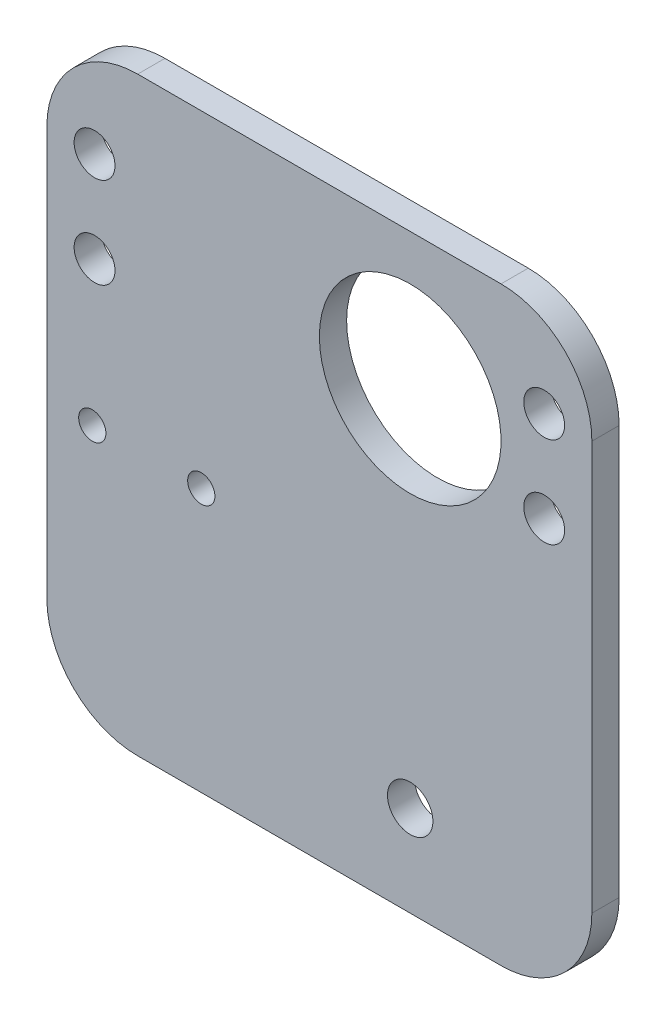
ISO-10303-21;
HEADER;
FILE_DESCRIPTION(('STEP AP214'),'2;1');
FILE_NAME('part.step','',(''),(''),'','','');
FILE_SCHEMA(('AUTOMOTIVE_DESIGN { 1 0 10303 214 1 1 1 1 }'));
ENDSEC;
DATA;
#1=APPLICATION_CONTEXT('core data for automotive mechanical design processes');
#2=APPLICATION_PROTOCOL_DEFINITION('international standard','automotive_design',2000,#1);
#3=PRODUCT_CONTEXT('',#1,'mechanical');
#4=PRODUCT('Part','Part','',(#3));
#5=PRODUCT_RELATED_PRODUCT_CATEGORY('part','',(#4));
#6=PRODUCT_DEFINITION_FORMATION('','',#4);
#7=PRODUCT_DEFINITION_CONTEXT('part definition',#1,'design');
#8=PRODUCT_DEFINITION('design','',#6,#7);
#9=PRODUCT_DEFINITION_SHAPE('','',#8);
#10=(LENGTH_UNIT() NAMED_UNIT(*) SI_UNIT(.MILLI.,.METRE.));
#11=(NAMED_UNIT(*) PLANE_ANGLE_UNIT() SI_UNIT($,.RADIAN.));
#12=(NAMED_UNIT(*) SI_UNIT($,.STERADIAN.) SOLID_ANGLE_UNIT());
#13=UNCERTAINTY_MEASURE_WITH_UNIT(LENGTH_MEASURE(1.E-05),#10,'distance_accuracy_value','');
#14=(GEOMETRIC_REPRESENTATION_CONTEXT(3) GLOBAL_UNCERTAINTY_ASSIGNED_CONTEXT((#13)) GLOBAL_UNIT_ASSIGNED_CONTEXT((#10,
#11,#12)) REPRESENTATION_CONTEXT('',''));
#15=CARTESIAN_POINT('',(0.,0.,0.));
#16=DIRECTION('',(0.,0.,1.));
#17=DIRECTION('',(1.,0.,0.));
#18=AXIS2_PLACEMENT_3D('',#15,#16,#17);
#19=CARTESIAN_POINT('',(0.,0.,0.001));
#20=DIRECTION('',(0.,0.,1.));
#21=DIRECTION('',(1.,0.,0.));
#22=AXIS2_PLACEMENT_3D('',#19,#20,#21);
#23=PLANE('',#22);
#24=CARTESIAN_POINT('',(45.5164785410153,-28.4674981786718,0.001));
#25=DIRECTION('',(0.,0.,-1.));
#26=DIRECTION('',(-1.,0.,0.));
#27=AXIS2_PLACEMENT_3D('',#24,#25,#26);
#28=CIRCLE('',#27,2.5);
#29=CARTESIAN_POINT('',(43.0164785410153,-28.4674981786718,0.001));
#30=VERTEX_POINT('',#29);
#31=EDGE_CURVE('E268',#30,#30,#28,.T.);
#32=ORIENTED_EDGE('',*,*,#31,.F.);
#33=EDGE_LOOP('',(#32));
#34=FACE_BOUND('',#33,.T.);
#35=CARTESIAN_POINT('',(45.5164785410153,-28.4674981786718,0.000999999999999916));
#36=DIRECTION('',(0.,0.,1.));
#37=DIRECTION('',(1.,0.,0.));
#38=AXIS2_PLACEMENT_3D('',#35,#36,#37);
#39=CIRCLE('',#38,7.5);
#40=CARTESIAN_POINT('',(53.0164785410153,-28.4674981786718,0.000999999999999916));
#41=VERTEX_POINT('',#40);
#42=EDGE_CURVE('E131',#41,#41,#39,.T.);
#43=ORIENTED_EDGE('',*,*,#42,.F.);
#44=EDGE_LOOP('',(#43));
#45=FACE_BOUND('',#44,.T.);
#46=ADVANCED_FACE('F39',(#34,#45),#23,.F.);
#47=CARTESIAN_POINT('',(45.5164785410153,-28.4674981786718,0.000999999999999916));
#48=DIRECTION('',(0.,0.,1.));
#49=DIRECTION('',(1.,0.,0.));
#50=AXIS2_PLACEMENT_3D('',#47,#48,#49);
#51=CIRCLE('',#50,9.5);
#52=CARTESIAN_POINT('',(55.0164785410153,-28.4674981786718,0.000999999999999916));
#53=VERTEX_POINT('',#52);
#54=EDGE_CURVE('E381',#53,#53,#51,.T.);
#55=ORIENTED_EDGE('',*,*,#54,.T.);
#56=EDGE_LOOP('',(#55));
#57=FACE_BOUND('',#56,.T.);
#58=CARTESIAN_POINT('',(10.5164785410153,-9.46749817867184,0.00100000000000013));
#59=DIRECTION('',(0.,0.,1.));
#60=DIRECTION('',(1.,0.,0.));
#61=AXIS2_PLACEMENT_3D('',#58,#59,#60);
#62=CIRCLE('',#61,1.5);
#63=CARTESIAN_POINT('',(12.0164785410153,-9.46749817867184,0.00100000000000013));
#64=VERTEX_POINT('',#63);
#65=EDGE_CURVE('E274',#64,#64,#62,.T.);
#66=ORIENTED_EDGE('',*,*,#65,.T.);
#67=EDGE_LOOP('',(#66));
#68=FACE_BOUND('',#67,.T.);
#69=CARTESIAN_POINT('',(22.5164785410153,-9.46749817867184,0.00100000000000013));
#70=DIRECTION('',(0.,0.,1.));
#71=DIRECTION('',(1.,0.,0.));
#72=AXIS2_PLACEMENT_3D('',#69,#70,#71);
#73=CIRCLE('',#72,1.5);
#74=CARTESIAN_POINT('',(24.0164785410153,-9.46749817867184,0.00100000000000013));
#75=VERTEX_POINT('',#74);
#76=EDGE_CURVE('E389',#75,#75,#73,.T.);
#77=ORIENTED_EDGE('',*,*,#76,.T.);
#78=EDGE_LOOP('',(#77));
#79=FACE_BOUND('',#78,.T.);
#80=CARTESIAN_POINT('',(45.5164785410153,11.5325018213282,0.001));
#81=DIRECTION('',(0.,0.,-1.));
#82=DIRECTION('',(-1.,0.,0.));
#83=AXIS2_PLACEMENT_3D('',#80,#81,#82);
#84=CIRCLE('',#83,10.);
#85=CARTESIAN_POINT('',(35.5164785410153,11.5325018213282,0.001));
#86=VERTEX_POINT('',#85);
#87=EDGE_CURVE('E267',#86,#86,#84,.T.);
#88=ORIENTED_EDGE('',*,*,#87,.F.);
#89=EDGE_LOOP('',(#88));
#90=FACE_BOUND('',#89,.T.);
#91=CARTESIAN_POINT('',(60.2664785410153,6.53250182132816,0.001));
#92=DIRECTION('',(0.,0.,1.));
#93=DIRECTION('',(1.,0.,0.));
#94=AXIS2_PLACEMENT_3D('',#91,#92,#93);
#95=CIRCLE('',#94,3.00000000000002);
#96=CARTESIAN_POINT('',(63.2664785410153,6.53250182132816,0.001));
#97=VERTEX_POINT('',#96);
#98=EDGE_CURVE('E191',#97,#97,#95,.F.);
#99=ORIENTED_EDGE('',*,*,#98,.F.);
#100=EDGE_LOOP('',(#99));
#101=FACE_BOUND('',#100,.T.);
#102=DIRECTION('',(1.,0.,0.));
#103=VECTOR('',#102,1.);
#104=CARTESIAN_POINT('',(5.51647854101529,26.5325018213282,0.001));
#105=LINE('',#104,#103);
#106=CARTESIAN_POINT('',(15.5164785410153,26.5325018213282,0.001));
#107=VERTEX_POINT('',#106);
#108=CARTESIAN_POINT('',(55.5164785410153,26.5325018213282,0.001));
#109=VERTEX_POINT('',#108);
#110=EDGE_CURVE('E109',#107,#109,#105,.T.);
#111=ORIENTED_EDGE('',*,*,#110,.T.);
#112=CARTESIAN_POINT('',(55.5164785410153,16.5325018213282,0.00100000000000013));
#113=DIRECTION('',(0.,0.,1.));
#114=DIRECTION('',(1.,0.,0.));
#115=AXIS2_PLACEMENT_3D('',#112,#113,#114);
#116=CIRCLE('',#115,10.);
#117=CARTESIAN_POINT('',(65.5164785410153,16.5325018213282,0.001));
#118=VERTEX_POINT('',#117);
#119=EDGE_CURVE('E143',#109,#118,#116,.F.);
#120=ORIENTED_EDGE('',*,*,#119,.T.);
#121=DIRECTION('',(0.,-1.,0.));
#122=VECTOR('',#121,1.);
#123=CARTESIAN_POINT('',(65.5164785410153,26.5325018213282,0.001));
#124=LINE('',#123,#122);
#125=CARTESIAN_POINT('',(65.5164785410153,-28.4674981786718,0.001));
#126=VERTEX_POINT('',#125);
#127=EDGE_CURVE('E127',#118,#126,#124,.T.);
#128=ORIENTED_EDGE('',*,*,#127,.T.);
#129=CARTESIAN_POINT('',(55.5164785410153,-28.4674981786718,0.00100000000000013));
#130=DIRECTION('',(0.,0.,1.));
#131=DIRECTION('',(1.,0.,0.));
#132=AXIS2_PLACEMENT_3D('',#129,#130,#131);
#133=CIRCLE('',#132,10.);
#134=CARTESIAN_POINT('',(55.5164785410153,-38.4674981786718,0.001));
#135=VERTEX_POINT('',#134);
#136=EDGE_CURVE('E141',#126,#135,#133,.F.);
#137=ORIENTED_EDGE('',*,*,#136,.T.);
#138=DIRECTION('',(1.,0.,0.));
#139=VECTOR('',#138,1.);
#140=CARTESIAN_POINT('',(5.51647854101529,-38.4674981786718,0.001));
#141=LINE('',#140,#139);
#142=CARTESIAN_POINT('',(15.5164785410153,-38.4674981786718,0.001));
#143=VERTEX_POINT('',#142);
#144=EDGE_CURVE('E177',#143,#135,#141,.T.);
#145=ORIENTED_EDGE('',*,*,#144,.F.);
#146=CARTESIAN_POINT('',(15.5164785410153,-28.4674981786718,0.00100000000000013));
#147=DIRECTION('',(0.,0.,1.));
#148=DIRECTION('',(1.,0.,0.));
#149=AXIS2_PLACEMENT_3D('',#146,#147,#148);
#150=CIRCLE('',#149,10.);
#151=CARTESIAN_POINT('',(5.51647854101529,-28.4674981786718,0.001));
#152=VERTEX_POINT('',#151);
#153=EDGE_CURVE('E116',#143,#152,#150,.F.);
#154=ORIENTED_EDGE('',*,*,#153,.T.);
#155=DIRECTION('',(0.,-1.,0.));
#156=VECTOR('',#155,1.);
#157=CARTESIAN_POINT('',(5.51647854101529,1.53250182132815,0.001));
#158=LINE('',#157,#156);
#159=CARTESIAN_POINT('',(5.51647854101529,16.5325018213282,0.001));
#160=VERTEX_POINT('',#159);
#161=EDGE_CURVE('E111',#160,#152,#158,.T.);
#162=ORIENTED_EDGE('',*,*,#161,.F.);
#163=CARTESIAN_POINT('',(15.5164785410153,16.5325018213282,0.00100000000000013));
#164=DIRECTION('',(0.,0.,1.));
#165=DIRECTION('',(1.,0.,0.));
#166=AXIS2_PLACEMENT_3D('',#163,#164,#165);
#167=CIRCLE('',#166,10.);
#168=EDGE_CURVE('E105',#160,#107,#167,.F.);
#169=ORIENTED_EDGE('',*,*,#168,.T.);
#170=EDGE_LOOP('',(#111,#120,#128,#137,#145,#154,#162,#169));
#171=FACE_BOUND('',#170,.T.);
#172=CARTESIAN_POINT('',(10.7664785410153,6.53250182132816,0.001));
#173=DIRECTION('',(0.,0.,1.));
#174=DIRECTION('',(1.,0.,0.));
#175=AXIS2_PLACEMENT_3D('',#172,#173,#174);
#176=CIRCLE('',#175,3.);
#177=CARTESIAN_POINT('',(13.7664785410153,6.53250182132816,0.001));
#178=VERTEX_POINT('',#177);
#179=EDGE_CURVE('E184',#178,#178,#176,.T.);
#180=ORIENTED_EDGE('',*,*,#179,.T.);
#181=EDGE_LOOP('',(#180));
#182=FACE_BOUND('',#181,.T.);
#183=CARTESIAN_POINT('',(60.2664785410153,16.5325018213282,0.001));
#184=DIRECTION('',(0.,0.,1.));
#185=DIRECTION('',(1.,0.,0.));
#186=AXIS2_PLACEMENT_3D('',#183,#184,#185);
#187=CIRCLE('',#186,3.00000000000002);
#188=CARTESIAN_POINT('',(63.2664785410153,16.5325018213282,0.001));
#189=VERTEX_POINT('',#188);
#190=EDGE_CURVE('E187',#189,#189,#187,.F.);
#191=ORIENTED_EDGE('',*,*,#190,.F.);
#192=EDGE_LOOP('',(#191));
#193=FACE_BOUND('',#192,.T.);
#194=CARTESIAN_POINT('',(10.7664785410153,16.5325018213282,0.001));
#195=DIRECTION('',(0.,0.,1.));
#196=DIRECTION('',(1.,0.,0.));
#197=AXIS2_PLACEMENT_3D('',#194,#195,#196);
#198=CIRCLE('',#197,3.);
#199=CARTESIAN_POINT('',(13.7664785410153,16.5325018213282,0.001));
#200=VERTEX_POINT('',#199);
#201=EDGE_CURVE('E135',#200,#200,#198,.F.);
#202=ORIENTED_EDGE('',*,*,#201,.F.);
#203=EDGE_LOOP('',(#202));
#204=FACE_BOUND('',#203,.T.);
#205=ADVANCED_FACE('F107',(#57,#68,#79,#90,#101,#171,#182,#193,#204),#23,.F.);
#206=CARTESIAN_POINT('',(10.7664785410153,6.53250182132816,0.001));
#207=DIRECTION('',(0.,0.,-1.));
#208=DIRECTION('',(-1.,0.,0.));
#209=AXIS2_PLACEMENT_3D('',#206,#207,#208);
#210=CYLINDRICAL_SURFACE('',#209,3.);
#211=ORIENTED_EDGE('',*,*,#179,.F.);
#212=EDGE_LOOP('',(#211));
#213=FACE_BOUND('',#212,.T.);
#214=CARTESIAN_POINT('',(10.7664785410153,6.53250182132816,0.));
#215=DIRECTION('',(0.,0.,1.));
#216=DIRECTION('',(1.,0.,0.));
#217=AXIS2_PLACEMENT_3D('',#214,#215,#216);
#218=CIRCLE('',#217,3.);
#219=CARTESIAN_POINT('',(13.7664785410153,6.53250182132816,0.));
#220=VERTEX_POINT('',#219);
#221=EDGE_CURVE('E183',#220,#220,#218,.T.);
#222=ORIENTED_EDGE('',*,*,#221,.T.);
#223=EDGE_LOOP('',(#222));
#224=FACE_BOUND('',#223,.T.);
#225=ADVANCED_FACE('F202',(#213,#224),#210,.T.);
#226=CARTESIAN_POINT('',(10.7664785410153,6.53250182132816,0.));
#227=DIRECTION('',(0.,0.,1.));
#228=DIRECTION('',(1.,0.,0.));
#229=AXIS2_PLACEMENT_3D('',#226,#227,#228);
#230=PLANE('',#229);
#231=CARTESIAN_POINT('',(10.7664785410153,6.53250182132816,0.));
#232=DIRECTION('',(0.,0.,1.));
#233=DIRECTION('',(1.,0.,0.));
#234=AXIS2_PLACEMENT_3D('',#231,#232,#233);
#235=CIRCLE('',#234,2.25);
#236=CARTESIAN_POINT('',(13.0164785410153,6.53250182132816,0.));
#237=VERTEX_POINT('',#236);
#238=EDGE_CURVE('E175',#237,#237,#235,.T.);
#239=ORIENTED_EDGE('',*,*,#238,.T.);
#240=EDGE_LOOP('',(#239));
#241=FACE_BOUND('',#240,.T.);
#242=ORIENTED_EDGE('',*,*,#221,.F.);
#243=EDGE_LOOP('',(#242));
#244=FACE_BOUND('',#243,.T.);
#245=ADVANCED_FACE('F209',(#241,#244),#230,.F.);
#246=CARTESIAN_POINT('',(10.7664785410153,6.53250182132816,0.));
#247=DIRECTION('',(0.,0.,1.));
#248=DIRECTION('',(1.,0.,0.));
#249=AXIS2_PLACEMENT_3D('',#246,#247,#248);
#250=CYLINDRICAL_SURFACE('',#249,2.25);
#251=ORIENTED_EDGE('',*,*,#238,.F.);
#252=EDGE_LOOP('',(#251));
#253=FACE_BOUND('',#252,.T.);
#254=CARTESIAN_POINT('',(10.7664785410153,6.53250182132816,3.001));
#255=DIRECTION('',(0.,0.,-1.));
#256=DIRECTION('',(-1.,0.,0.));
#257=AXIS2_PLACEMENT_3D('',#254,#255,#256);
#258=CIRCLE('',#257,2.25);
#259=CARTESIAN_POINT('',(8.51647854101528,6.53250182132816,3.001));
#260=VERTEX_POINT('',#259);
#261=EDGE_CURVE('E282',#260,#260,#258,.T.);
#262=ORIENTED_EDGE('',*,*,#261,.F.);
#263=EDGE_LOOP('',(#262));
#264=FACE_BOUND('',#263,.T.);
#265=ADVANCED_FACE('F231',(#253,#264),#250,.F.);
#266=CARTESIAN_POINT('',(0.,0.,3.001));
#267=DIRECTION('',(0.,0.,1.));
#268=DIRECTION('',(1.,0.,0.));
#269=AXIS2_PLACEMENT_3D('',#266,#267,#268);
#270=PLANE('',#269);
#271=CARTESIAN_POINT('',(10.5164785410153,-9.46749817867184,3.001));
#272=DIRECTION('',(0.,0.,1.));
#273=DIRECTION('',(1.,0.,0.));
#274=AXIS2_PLACEMENT_3D('',#271,#272,#273);
#275=CIRCLE('',#274,1.5);
#276=CARTESIAN_POINT('',(12.0164785410153,-9.46749817867184,3.001));
#277=VERTEX_POINT('',#276);
#278=EDGE_CURVE('E386',#277,#277,#275,.T.);
#279=ORIENTED_EDGE('',*,*,#278,.F.);
#280=EDGE_LOOP('',(#279));
#281=FACE_BOUND('',#280,.T.);
#282=CARTESIAN_POINT('',(22.5164785410153,-9.46749817867184,3.001));
#283=DIRECTION('',(0.,0.,1.));
#284=DIRECTION('',(1.,0.,0.));
#285=AXIS2_PLACEMENT_3D('',#282,#283,#284);
#286=CIRCLE('',#285,1.5);
#287=CARTESIAN_POINT('',(24.0164785410153,-9.46749817867184,3.001));
#288=VERTEX_POINT('',#287);
#289=EDGE_CURVE('E385',#288,#288,#286,.T.);
#290=ORIENTED_EDGE('',*,*,#289,.F.);
#291=EDGE_LOOP('',(#290));
#292=FACE_BOUND('',#291,.T.);
#293=CARTESIAN_POINT('',(60.2664785410153,16.5325018213282,3.001));
#294=DIRECTION('',(0.,0.,-1.));
#295=DIRECTION('',(-1.,0.,0.));
#296=AXIS2_PLACEMENT_3D('',#293,#294,#295);
#297=CIRCLE('',#296,2.25);
#298=CARTESIAN_POINT('',(58.0164785410153,16.5325018213282,3.001));
#299=VERTEX_POINT('',#298);
#300=EDGE_CURVE('E285',#299,#299,#297,.T.);
#301=ORIENTED_EDGE('',*,*,#300,.T.);
#302=EDGE_LOOP('',(#301));
#303=FACE_BOUND('',#302,.T.);
#304=ORIENTED_EDGE('',*,*,#261,.T.);
#305=EDGE_LOOP('',(#304));
#306=FACE_BOUND('',#305,.T.);
#307=CARTESIAN_POINT('',(10.7664785410153,16.5325018213282,3.001));
#308=DIRECTION('',(0.,0.,-1.));
#309=DIRECTION('',(-1.,0.,0.));
#310=AXIS2_PLACEMENT_3D('',#307,#308,#309);
#311=CIRCLE('',#310,2.25);
#312=CARTESIAN_POINT('',(8.51647854101528,16.5325018213282,3.001));
#313=VERTEX_POINT('',#312);
#314=EDGE_CURVE('E279',#313,#313,#311,.T.);
#315=ORIENTED_EDGE('',*,*,#314,.T.);
#316=EDGE_LOOP('',(#315));
#317=FACE_BOUND('',#316,.T.);
#318=CARTESIAN_POINT('',(45.5164785410153,11.5325018213282,3.001));
#319=DIRECTION('',(0.,0.,-1.));
#320=DIRECTION('',(-1.,0.,0.));
#321=AXIS2_PLACEMENT_3D('',#318,#319,#320);
#322=CIRCLE('',#321,10.);
#323=CARTESIAN_POINT('',(35.5164785410153,11.5325018213282,3.001));
#324=VERTEX_POINT('',#323);
#325=EDGE_CURVE('E271',#324,#324,#322,.T.);
#326=ORIENTED_EDGE('',*,*,#325,.T.);
#327=EDGE_LOOP('',(#326));
#328=FACE_BOUND('',#327,.T.);
#329=CARTESIAN_POINT('',(60.2664785410153,6.53250182132816,3.001));
#330=DIRECTION('',(0.,0.,-1.));
#331=DIRECTION('',(-1.,0.,0.));
#332=AXIS2_PLACEMENT_3D('',#329,#330,#331);
#333=CIRCLE('',#332,2.25);
#334=CARTESIAN_POINT('',(58.0164785410153,6.53250182132816,3.001));
#335=VERTEX_POINT('',#334);
#336=EDGE_CURVE('E288',#335,#335,#333,.T.);
#337=ORIENTED_EDGE('',*,*,#336,.T.);
#338=EDGE_LOOP('',(#337));
#339=FACE_BOUND('',#338,.T.);
#340=DIRECTION('',(0.,-1.,0.));
#341=VECTOR('',#340,1.);
#342=CARTESIAN_POINT('',(65.5164785410153,26.5325018213282,3.001));
#343=LINE('',#342,#341);
#344=CARTESIAN_POINT('',(65.5164785410153,16.5325018213282,3.001));
#345=VERTEX_POINT('',#344);
#346=CARTESIAN_POINT('',(65.5164785410153,-28.4674981786718,3.001));
#347=VERTEX_POINT('',#346);
#348=EDGE_CURVE('E165',#345,#347,#343,.T.);
#349=ORIENTED_EDGE('',*,*,#348,.F.);
#350=CARTESIAN_POINT('',(55.5164785410153,16.5325018213282,3.001));
#351=DIRECTION('',(0.,0.,1.));
#352=DIRECTION('',(1.,0.,0.));
#353=AXIS2_PLACEMENT_3D('',#350,#351,#352);
#354=CIRCLE('',#353,10.);
#355=CARTESIAN_POINT('',(55.5164785410153,26.5325018213282,3.001));
#356=VERTEX_POINT('',#355);
#357=EDGE_CURVE('E154',#345,#356,#354,.T.);
#358=ORIENTED_EDGE('',*,*,#357,.T.);
#359=DIRECTION('',(1.,0.,0.));
#360=VECTOR('',#359,1.);
#361=CARTESIAN_POINT('',(5.51647854101529,26.5325018213282,3.001));
#362=LINE('',#361,#360);
#363=CARTESIAN_POINT('',(15.5164785410153,26.5325018213282,3.001));
#364=VERTEX_POINT('',#363);
#365=EDGE_CURVE('E173',#364,#356,#362,.T.);
#366=ORIENTED_EDGE('',*,*,#365,.F.);
#367=CARTESIAN_POINT('',(15.5164785410153,16.5325018213282,3.001));
#368=DIRECTION('',(0.,0.,1.));
#369=DIRECTION('',(1.,0.,0.));
#370=AXIS2_PLACEMENT_3D('',#367,#368,#369);
#371=CIRCLE('',#370,10.);
#372=CARTESIAN_POINT('',(5.51647854101529,16.5325018213282,3.001));
#373=VERTEX_POINT('',#372);
#374=EDGE_CURVE('E130',#364,#373,#371,.T.);
#375=ORIENTED_EDGE('',*,*,#374,.T.);
#376=DIRECTION('',(0.,-1.,0.));
#377=VECTOR('',#376,1.);
#378=CARTESIAN_POINT('',(5.51647854101529,26.5325018213282,3.001));
#379=LINE('',#378,#377);
#380=CARTESIAN_POINT('',(5.51647854101529,-28.4674981786718,3.001));
#381=VERTEX_POINT('',#380);
#382=EDGE_CURVE('E126',#373,#381,#379,.T.);
#383=ORIENTED_EDGE('',*,*,#382,.T.);
#384=CARTESIAN_POINT('',(15.5164785410153,-28.4674981786718,3.001));
#385=DIRECTION('',(0.,0.,1.));
#386=DIRECTION('',(1.,0.,0.));
#387=AXIS2_PLACEMENT_3D('',#384,#385,#386);
#388=CIRCLE('',#387,10.);
#389=CARTESIAN_POINT('',(15.5164785410153,-38.4674981786718,3.001));
#390=VERTEX_POINT('',#389);
#391=EDGE_CURVE('E61',#381,#390,#388,.T.);
#392=ORIENTED_EDGE('',*,*,#391,.T.);
#393=DIRECTION('',(1.,0.,0.));
#394=VECTOR('',#393,1.);
#395=CARTESIAN_POINT('',(5.51647854101529,-38.4674981786718,3.001));
#396=LINE('',#395,#394);
#397=CARTESIAN_POINT('',(55.5164785410153,-38.4674981786718,3.001));
#398=VERTEX_POINT('',#397);
#399=EDGE_CURVE('E163',#390,#398,#396,.T.);
#400=ORIENTED_EDGE('',*,*,#399,.T.);
#401=CARTESIAN_POINT('',(55.5164785410153,-28.4674981786718,3.001));
#402=DIRECTION('',(0.,0.,1.));
#403=DIRECTION('',(1.,0.,0.));
#404=AXIS2_PLACEMENT_3D('',#401,#402,#403);
#405=CIRCLE('',#404,10.);
#406=EDGE_CURVE('E152',#398,#347,#405,.T.);
#407=ORIENTED_EDGE('',*,*,#406,.T.);
#408=EDGE_LOOP('',(#349,#358,#366,#375,#383,#392,#400,#407));
#409=FACE_BOUND('',#408,.T.);
#410=CARTESIAN_POINT('',(45.5164785410153,-28.4674981786718,3.001));
#411=DIRECTION('',(0.,0.,-1.));
#412=DIRECTION('',(-1.,0.,0.));
#413=AXIS2_PLACEMENT_3D('',#410,#411,#412);
#414=CIRCLE('',#413,2.5);
#415=CARTESIAN_POINT('',(43.0164785410153,-28.4674981786718,3.001));
#416=VERTEX_POINT('',#415);
#417=EDGE_CURVE('E265',#416,#416,#414,.T.);
#418=ORIENTED_EDGE('',*,*,#417,.T.);
#419=EDGE_LOOP('',(#418));
#420=FACE_BOUND('',#419,.T.);
#421=ADVANCED_FACE('F217',(#281,#292,#303,#306,#317,#328,#339,#409,#420),#270,.T.);
#422=CARTESIAN_POINT('',(5.51647854101529,26.5325018213282,3.001));
#423=DIRECTION('',(0.,1.,0.));
#424=DIRECTION('',(0.,0.,1.));
#425=AXIS2_PLACEMENT_3D('',#422,#423,#424);
#426=PLANE('',#425);
#427=ORIENTED_EDGE('',*,*,#365,.T.);
#428=DIRECTION('',(0.,0.,-1.));
#429=VECTOR('',#428,1.);
#430=CARTESIAN_POINT('',(55.5164785410153,26.5325018213282,3.001));
#431=LINE('',#430,#429);
#432=EDGE_CURVE('E117',#356,#109,#431,.T.);
#433=ORIENTED_EDGE('',*,*,#432,.T.);
#434=ORIENTED_EDGE('',*,*,#110,.F.);
#435=DIRECTION('',(0.,0.,-1.));
#436=VECTOR('',#435,1.);
#437=CARTESIAN_POINT('',(15.5164785410153,26.5325018213282,3.001));
#438=LINE('',#437,#436);
#439=EDGE_CURVE('E123',#107,#364,#438,.F.);
#440=ORIENTED_EDGE('',*,*,#439,.T.);
#441=EDGE_LOOP('',(#427,#433,#434,#440));
#442=FACE_BOUND('',#441,.T.);
#443=ADVANCED_FACE('F122',(#442),#426,.T.);
#444=CARTESIAN_POINT('',(65.5164785410153,26.5325018213282,3.001));
#445=DIRECTION('',(1.,0.,0.));
#446=DIRECTION('',(0.,0.,-1.));
#447=AXIS2_PLACEMENT_3D('',#444,#445,#446);
#448=PLANE('',#447);
#449=ORIENTED_EDGE('',*,*,#127,.F.);
#450=DIRECTION('',(0.,0.,-1.));
#451=VECTOR('',#450,1.);
#452=CARTESIAN_POINT('',(65.5164785410153,16.5325018213282,3.001));
#453=LINE('',#452,#451);
#454=EDGE_CURVE('E148',#118,#345,#453,.F.);
#455=ORIENTED_EDGE('',*,*,#454,.T.);
#456=ORIENTED_EDGE('',*,*,#348,.T.);
#457=DIRECTION('',(0.,0.,-1.));
#458=VECTOR('',#457,1.);
#459=CARTESIAN_POINT('',(65.5164785410153,-28.4674981786718,0.00100000000000013));
#460=LINE('',#459,#458);
#461=EDGE_CURVE('E145',#347,#126,#460,.T.);
#462=ORIENTED_EDGE('',*,*,#461,.T.);
#463=EDGE_LOOP('',(#449,#455,#456,#462));
#464=FACE_BOUND('',#463,.T.);
#465=ADVANCED_FACE('F221',(#464),#448,.T.);
#466=CARTESIAN_POINT('',(5.51647854101529,-38.4674981786718,3.001));
#467=DIRECTION('',(0.,1.,0.));
#468=DIRECTION('',(0.,0.,1.));
#469=AXIS2_PLACEMENT_3D('',#466,#467,#468);
#470=PLANE('',#469);
#471=ORIENTED_EDGE('',*,*,#144,.T.);
#472=DIRECTION('',(0.,0.,-1.));
#473=VECTOR('',#472,1.);
#474=CARTESIAN_POINT('',(55.5164785410153,-38.4674981786718,3.001));
#475=LINE('',#474,#473);
#476=EDGE_CURVE('E54',#135,#398,#475,.F.);
#477=ORIENTED_EDGE('',*,*,#476,.T.);
#478=ORIENTED_EDGE('',*,*,#399,.F.);
#479=DIRECTION('',(0.,0.,-1.));
#480=VECTOR('',#479,1.);
#481=CARTESIAN_POINT('',(15.5164785410153,-38.4674981786718,3.001));
#482=LINE('',#481,#480);
#483=EDGE_CURVE('E156',#390,#143,#482,.T.);
#484=ORIENTED_EDGE('',*,*,#483,.T.);
#485=EDGE_LOOP('',(#471,#477,#478,#484));
#486=FACE_BOUND('',#485,.T.);
#487=ADVANCED_FACE('F224',(#486),#470,.F.);
#488=CARTESIAN_POINT('',(5.51647854101529,1.53250182132815,3.001));
#489=DIRECTION('',(1.,0.,0.));
#490=DIRECTION('',(0.,1.,0.));
#491=AXIS2_PLACEMENT_3D('',#488,#489,#490);
#492=PLANE('',#491);
#493=ORIENTED_EDGE('',*,*,#161,.T.);
#494=DIRECTION('',(0.,0.,-1.));
#495=VECTOR('',#494,1.);
#496=CARTESIAN_POINT('',(5.51647854101529,-28.4674981786718,3.001));
#497=LINE('',#496,#495);
#498=EDGE_CURVE('E11',#152,#381,#497,.F.);
#499=ORIENTED_EDGE('',*,*,#498,.T.);
#500=ORIENTED_EDGE('',*,*,#382,.F.);
#501=DIRECTION('',(0.,0.,-1.));
#502=VECTOR('',#501,1.);
#503=CARTESIAN_POINT('',(5.51647854101529,16.5325018213282,0.00100000000000013));
#504=LINE('',#503,#502);
#505=EDGE_CURVE('E47',#373,#160,#504,.T.);
#506=ORIENTED_EDGE('',*,*,#505,.T.);
#507=EDGE_LOOP('',(#493,#499,#500,#506));
#508=FACE_BOUND('',#507,.T.);
#509=ADVANCED_FACE('F161',(#508),#492,.F.);
#510=CARTESIAN_POINT('',(60.2664785410153,16.5325018213282,0.001));
#511=DIRECTION('',(0.,0.,-1.));
#512=DIRECTION('',(-1.,0.,0.));
#513=AXIS2_PLACEMENT_3D('',#510,#511,#512);
#514=CYLINDRICAL_SURFACE('',#513,3.00000000000002);
#515=ORIENTED_EDGE('',*,*,#190,.T.);
#516=EDGE_LOOP('',(#515));
#517=FACE_BOUND('',#516,.T.);
#518=CARTESIAN_POINT('',(60.2664785410153,16.5325018213282,0.));
#519=DIRECTION('',(0.,0.,1.));
#520=DIRECTION('',(1.,0.,0.));
#521=AXIS2_PLACEMENT_3D('',#518,#519,#520);
#522=CIRCLE('',#521,3.00000000000002);
#523=CARTESIAN_POINT('',(63.2664785410153,16.5325018213282,0.));
#524=VERTEX_POINT('',#523);
#525=EDGE_CURVE('E168',#524,#524,#522,.T.);
#526=ORIENTED_EDGE('',*,*,#525,.T.);
#527=EDGE_LOOP('',(#526));
#528=FACE_BOUND('',#527,.T.);
#529=ADVANCED_FACE('F230',(#517,#528),#514,.T.);
#530=CARTESIAN_POINT('',(60.2664785410153,16.5325018213282,0.));
#531=DIRECTION('',(0.,0.,1.));
#532=DIRECTION('',(1.,0.,0.));
#533=AXIS2_PLACEMENT_3D('',#530,#531,#532);
#534=PLANE('',#533);
#535=CARTESIAN_POINT('',(60.2664785410153,16.5325018213282,0.));
#536=DIRECTION('',(0.,0.,1.));
#537=DIRECTION('',(1.,0.,0.));
#538=AXIS2_PLACEMENT_3D('',#535,#536,#537);
#539=CIRCLE('',#538,2.25);
#540=CARTESIAN_POINT('',(62.5164785410153,16.5325018213282,0.));
#541=VERTEX_POINT('',#540);
#542=EDGE_CURVE('E304',#541,#541,#539,.T.);
#543=ORIENTED_EDGE('',*,*,#542,.T.);
#544=EDGE_LOOP('',(#543));
#545=FACE_BOUND('',#544,.T.);
#546=ORIENTED_EDGE('',*,*,#525,.F.);
#547=EDGE_LOOP('',(#546));
#548=FACE_BOUND('',#547,.T.);
#549=ADVANCED_FACE('F312',(#545,#548),#534,.F.);
#550=CARTESIAN_POINT('',(60.2664785410153,16.5325018213282,0.));
#551=DIRECTION('',(0.,0.,1.));
#552=DIRECTION('',(1.,0.,0.));
#553=AXIS2_PLACEMENT_3D('',#550,#551,#552);
#554=CYLINDRICAL_SURFACE('',#553,2.25);
#555=ORIENTED_EDGE('',*,*,#542,.F.);
#556=EDGE_LOOP('',(#555));
#557=FACE_BOUND('',#556,.T.);
#558=ORIENTED_EDGE('',*,*,#300,.F.);
#559=EDGE_LOOP('',(#558));
#560=FACE_BOUND('',#559,.T.);
#561=ADVANCED_FACE('F314',(#557,#560),#554,.F.);
#562=CARTESIAN_POINT('',(60.2664785410153,6.53250182132816,0.001));
#563=DIRECTION('',(0.,0.,-1.));
#564=DIRECTION('',(-1.,0.,0.));
#565=AXIS2_PLACEMENT_3D('',#562,#563,#564);
#566=CYLINDRICAL_SURFACE('',#565,3.00000000000002);
#567=ORIENTED_EDGE('',*,*,#98,.T.);
#568=EDGE_LOOP('',(#567));
#569=FACE_BOUND('',#568,.T.);
#570=CARTESIAN_POINT('',(60.2664785410153,6.53250182132816,0.));
#571=DIRECTION('',(0.,0.,1.));
#572=DIRECTION('',(1.,0.,0.));
#573=AXIS2_PLACEMENT_3D('',#570,#571,#572);
#574=CIRCLE('',#573,3.00000000000002);
#575=CARTESIAN_POINT('',(63.2664785410153,6.53250182132816,0.));
#576=VERTEX_POINT('',#575);
#577=EDGE_CURVE('E302',#576,#576,#574,.T.);
#578=ORIENTED_EDGE('',*,*,#577,.T.);
#579=EDGE_LOOP('',(#578));
#580=FACE_BOUND('',#579,.T.);
#581=ADVANCED_FACE('F319',(#569,#580),#566,.T.);
#582=CARTESIAN_POINT('',(60.2664785410153,6.53250182132816,0.));
#583=DIRECTION('',(0.,0.,1.));
#584=DIRECTION('',(1.,0.,0.));
#585=AXIS2_PLACEMENT_3D('',#582,#583,#584);
#586=PLANE('',#585);
#587=CARTESIAN_POINT('',(60.2664785410153,6.53250182132816,0.));
#588=DIRECTION('',(0.,0.,1.));
#589=DIRECTION('',(1.,0.,0.));
#590=AXIS2_PLACEMENT_3D('',#587,#588,#589);
#591=CIRCLE('',#590,2.25);
#592=CARTESIAN_POINT('',(62.5164785410153,6.53250182132816,0.));
#593=VERTEX_POINT('',#592);
#594=EDGE_CURVE('E299',#593,#593,#591,.T.);
#595=ORIENTED_EDGE('',*,*,#594,.T.);
#596=EDGE_LOOP('',(#595));
#597=FACE_BOUND('',#596,.T.);
#598=ORIENTED_EDGE('',*,*,#577,.F.);
#599=EDGE_LOOP('',(#598));
#600=FACE_BOUND('',#599,.T.);
#601=ADVANCED_FACE('F325',(#597,#600),#586,.F.);
#602=CARTESIAN_POINT('',(60.2664785410153,6.53250182132816,0.));
#603=DIRECTION('',(0.,0.,1.));
#604=DIRECTION('',(1.,0.,0.));
#605=AXIS2_PLACEMENT_3D('',#602,#603,#604);
#606=CYLINDRICAL_SURFACE('',#605,2.25);
#607=ORIENTED_EDGE('',*,*,#594,.F.);
#608=EDGE_LOOP('',(#607));
#609=FACE_BOUND('',#608,.T.);
#610=ORIENTED_EDGE('',*,*,#336,.F.);
#611=EDGE_LOOP('',(#610));
#612=FACE_BOUND('',#611,.T.);
#613=ADVANCED_FACE('F328',(#609,#612),#606,.F.);
#614=CARTESIAN_POINT('',(10.7664785410153,16.5325018213282,0.001));
#615=DIRECTION('',(0.,0.,-1.));
#616=DIRECTION('',(-1.,0.,0.));
#617=AXIS2_PLACEMENT_3D('',#614,#615,#616);
#618=CYLINDRICAL_SURFACE('',#617,3.);
#619=ORIENTED_EDGE('',*,*,#201,.T.);
#620=EDGE_LOOP('',(#619));
#621=FACE_BOUND('',#620,.T.);
#622=CARTESIAN_POINT('',(10.7664785410153,16.5325018213282,0.));
#623=DIRECTION('',(0.,0.,1.));
#624=DIRECTION('',(1.,0.,0.));
#625=AXIS2_PLACEMENT_3D('',#622,#623,#624);
#626=CIRCLE('',#625,3.);
#627=CARTESIAN_POINT('',(13.7664785410153,16.5325018213282,0.));
#628=VERTEX_POINT('',#627);
#629=EDGE_CURVE('E296',#628,#628,#626,.T.);
#630=ORIENTED_EDGE('',*,*,#629,.T.);
#631=EDGE_LOOP('',(#630));
#632=FACE_BOUND('',#631,.T.);
#633=ADVANCED_FACE('F198',(#621,#632),#618,.T.);
#634=CARTESIAN_POINT('',(10.7664785410153,16.5325018213282,0.));
#635=DIRECTION('',(0.,0.,1.));
#636=DIRECTION('',(1.,0.,0.));
#637=AXIS2_PLACEMENT_3D('',#634,#635,#636);
#638=PLANE('',#637);
#639=CARTESIAN_POINT('',(10.7664785410153,16.5325018213282,0.));
#640=DIRECTION('',(0.,0.,1.));
#641=DIRECTION('',(1.,0.,0.));
#642=AXIS2_PLACEMENT_3D('',#639,#640,#641);
#643=CIRCLE('',#642,2.25);
#644=CARTESIAN_POINT('',(13.0164785410153,16.5325018213282,0.));
#645=VERTEX_POINT('',#644);
#646=EDGE_CURVE('E293',#645,#645,#643,.T.);
#647=ORIENTED_EDGE('',*,*,#646,.T.);
#648=EDGE_LOOP('',(#647));
#649=FACE_BOUND('',#648,.T.);
#650=ORIENTED_EDGE('',*,*,#629,.F.);
#651=EDGE_LOOP('',(#650));
#652=FACE_BOUND('',#651,.T.);
#653=ADVANCED_FACE('F335',(#649,#652),#638,.F.);
#654=CARTESIAN_POINT('',(10.7664785410153,16.5325018213282,0.));
#655=DIRECTION('',(0.,0.,1.));
#656=DIRECTION('',(1.,0.,0.));
#657=AXIS2_PLACEMENT_3D('',#654,#655,#656);
#658=CYLINDRICAL_SURFACE('',#657,2.25);
#659=ORIENTED_EDGE('',*,*,#646,.F.);
#660=EDGE_LOOP('',(#659));
#661=FACE_BOUND('',#660,.T.);
#662=ORIENTED_EDGE('',*,*,#314,.F.);
#663=EDGE_LOOP('',(#662));
#664=FACE_BOUND('',#663,.T.);
#665=ADVANCED_FACE('F338',(#661,#664),#658,.F.);
#666=CARTESIAN_POINT('',(45.5164785410153,11.5325018213282,3.001));
#667=DIRECTION('',(0.,0.,-1.));
#668=DIRECTION('',(-1.,0.,0.));
#669=AXIS2_PLACEMENT_3D('',#666,#667,#668);
#670=CYLINDRICAL_SURFACE('',#669,10.);
#671=ORIENTED_EDGE('',*,*,#325,.F.);
#672=EDGE_LOOP('',(#671));
#673=FACE_BOUND('',#672,.T.);
#674=ORIENTED_EDGE('',*,*,#87,.T.);
#675=EDGE_LOOP('',(#674));
#676=FACE_BOUND('',#675,.T.);
#677=ADVANCED_FACE('F344',(#673,#676),#670,.F.);
#678=CARTESIAN_POINT('',(45.5164785410153,-28.4674981786718,3.001));
#679=DIRECTION('',(0.,0.,-1.));
#680=DIRECTION('',(-1.,0.,0.));
#681=AXIS2_PLACEMENT_3D('',#678,#679,#680);
#682=CYLINDRICAL_SURFACE('',#681,2.5);
#683=ORIENTED_EDGE('',*,*,#417,.F.);
#684=EDGE_LOOP('',(#683));
#685=FACE_BOUND('',#684,.T.);
#686=ORIENTED_EDGE('',*,*,#31,.T.);
#687=EDGE_LOOP('',(#686));
#688=FACE_BOUND('',#687,.T.);
#689=ADVANCED_FACE('F348',(#685,#688),#682,.F.);
#690=CARTESIAN_POINT('',(22.5164785410153,-9.46749817867184,-6.999));
#691=DIRECTION('',(0.,0.,1.));
#692=DIRECTION('',(1.,0.,0.));
#693=AXIS2_PLACEMENT_3D('',#690,#691,#692);
#694=CYLINDRICAL_SURFACE('',#693,1.5);
#695=ORIENTED_EDGE('',*,*,#289,.T.);
#696=EDGE_LOOP('',(#695));
#697=FACE_BOUND('',#696,.T.);
#698=ORIENTED_EDGE('',*,*,#76,.F.);
#699=EDGE_LOOP('',(#698));
#700=FACE_BOUND('',#699,.T.);
#701=ADVANCED_FACE('F352',(#697,#700),#694,.F.);
#702=CARTESIAN_POINT('',(10.5164785410153,-9.46749817867184,-6.999));
#703=DIRECTION('',(0.,0.,1.));
#704=DIRECTION('',(1.,0.,0.));
#705=AXIS2_PLACEMENT_3D('',#702,#703,#704);
#706=CYLINDRICAL_SURFACE('',#705,1.5);
#707=ORIENTED_EDGE('',*,*,#278,.T.);
#708=EDGE_LOOP('',(#707));
#709=FACE_BOUND('',#708,.T.);
#710=ORIENTED_EDGE('',*,*,#65,.F.);
#711=EDGE_LOOP('',(#710));
#712=FACE_BOUND('',#711,.T.);
#713=ADVANCED_FACE('F355',(#709,#712),#706,.F.);
#714=CARTESIAN_POINT('',(45.5164785410153,-28.4674981786718,-1.899));
#715=DIRECTION('',(0.,0.,1.));
#716=DIRECTION('',(1.,0.,0.));
#717=AXIS2_PLACEMENT_3D('',#714,#715,#716);
#718=CYLINDRICAL_SURFACE('',#717,9.5);
#719=CARTESIAN_POINT('',(45.5164785410153,-28.4674981786718,-1.899));
#720=DIRECTION('',(0.,0.,1.));
#721=DIRECTION('',(1.,0.,0.));
#722=AXIS2_PLACEMENT_3D('',#719,#720,#721);
#723=CIRCLE('',#722,9.5);
#724=CARTESIAN_POINT('',(55.0164785410153,-28.4674981786718,-1.899));
#725=VERTEX_POINT('',#724);
#726=EDGE_CURVE('E378',#725,#725,#723,.T.);
#727=ORIENTED_EDGE('',*,*,#726,.T.);
#728=EDGE_LOOP('',(#727));
#729=FACE_BOUND('',#728,.T.);
#730=ORIENTED_EDGE('',*,*,#54,.F.);
#731=EDGE_LOOP('',(#730));
#732=FACE_BOUND('',#731,.T.);
#733=ADVANCED_FACE('F359',(#729,#732),#718,.T.);
#734=CARTESIAN_POINT('',(45.5164785410153,-28.4674981786718,-1.899));
#735=DIRECTION('',(0.,0.,1.));
#736=DIRECTION('',(1.,0.,0.));
#737=AXIS2_PLACEMENT_3D('',#734,#735,#736);
#738=CYLINDRICAL_SURFACE('',#737,7.5);
#739=CARTESIAN_POINT('',(45.5164785410153,-28.4674981786718,-1.899));
#740=DIRECTION('',(0.,0.,1.));
#741=DIRECTION('',(1.,0.,0.));
#742=AXIS2_PLACEMENT_3D('',#739,#740,#741);
#743=CIRCLE('',#742,7.5);
#744=CARTESIAN_POINT('',(53.0164785410153,-28.4674981786718,-1.899));
#745=VERTEX_POINT('',#744);
#746=EDGE_CURVE('E375',#745,#745,#743,.T.);
#747=ORIENTED_EDGE('',*,*,#746,.F.);
#748=EDGE_LOOP('',(#747));
#749=FACE_BOUND('',#748,.T.);
#750=ORIENTED_EDGE('',*,*,#42,.T.);
#751=EDGE_LOOP('',(#750));
#752=FACE_BOUND('',#751,.T.);
#753=ADVANCED_FACE('F363',(#749,#752),#738,.F.);
#754=CARTESIAN_POINT('',(45.5164785410153,-28.4674981786718,-1.899));
#755=DIRECTION('',(0.,0.,1.));
#756=DIRECTION('',(1.,0.,0.));
#757=AXIS2_PLACEMENT_3D('',#754,#755,#756);
#758=PLANE('',#757);
#759=ORIENTED_EDGE('',*,*,#746,.T.);
#760=EDGE_LOOP('',(#759));
#761=FACE_BOUND('',#760,.T.);
#762=ORIENTED_EDGE('',*,*,#726,.F.);
#763=EDGE_LOOP('',(#762));
#764=FACE_BOUND('',#763,.T.);
#765=ADVANCED_FACE('F242',(#761,#764),#758,.F.);
#766=CARTESIAN_POINT('',(55.5164785410153,16.5325018213282,3.001));
#767=DIRECTION('',(0.,0.,-1.));
#768=DIRECTION('',(-1.,0.,0.));
#769=AXIS2_PLACEMENT_3D('',#766,#767,#768);
#770=CYLINDRICAL_SURFACE('',#769,10.);
#771=ORIENTED_EDGE('',*,*,#357,.F.);
#772=ORIENTED_EDGE('',*,*,#454,.F.);
#773=ORIENTED_EDGE('',*,*,#119,.F.);
#774=ORIENTED_EDGE('',*,*,#432,.F.);
#775=EDGE_LOOP('',(#771,#772,#773,#774));
#776=FACE_BOUND('',#775,.T.);
#777=ADVANCED_FACE('F238',(#776),#770,.T.);
#778=CARTESIAN_POINT('',(55.5164785410153,-28.4674981786718,3.001));
#779=DIRECTION('',(0.,0.,1.));
#780=DIRECTION('',(1.,0.,0.));
#781=AXIS2_PLACEMENT_3D('',#778,#779,#780);
#782=CYLINDRICAL_SURFACE('',#781,10.);
#783=ORIENTED_EDGE('',*,*,#406,.F.);
#784=ORIENTED_EDGE('',*,*,#476,.F.);
#785=ORIENTED_EDGE('',*,*,#136,.F.);
#786=ORIENTED_EDGE('',*,*,#461,.F.);
#787=EDGE_LOOP('',(#783,#784,#785,#786));
#788=FACE_BOUND('',#787,.T.);
#789=ADVANCED_FACE('F241',(#788),#782,.T.);
#790=CARTESIAN_POINT('',(15.5164785410153,-28.4674981786718,3.001));
#791=DIRECTION('',(0.,0.,-1.));
#792=DIRECTION('',(-1.,0.,0.));
#793=AXIS2_PLACEMENT_3D('',#790,#791,#792);
#794=CYLINDRICAL_SURFACE('',#793,10.);
#795=ORIENTED_EDGE('',*,*,#391,.F.);
#796=ORIENTED_EDGE('',*,*,#498,.F.);
#797=ORIENTED_EDGE('',*,*,#153,.F.);
#798=ORIENTED_EDGE('',*,*,#483,.F.);
#799=EDGE_LOOP('',(#795,#796,#797,#798));
#800=FACE_BOUND('',#799,.T.);
#801=ADVANCED_FACE('F245',(#800),#794,.T.);
#802=CARTESIAN_POINT('',(15.5164785410153,16.5325018213282,3.001));
#803=DIRECTION('',(0.,0.,1.));
#804=DIRECTION('',(1.,0.,0.));
#805=AXIS2_PLACEMENT_3D('',#802,#803,#804);
#806=CYLINDRICAL_SURFACE('',#805,10.);
#807=ORIENTED_EDGE('',*,*,#374,.F.);
#808=ORIENTED_EDGE('',*,*,#439,.F.);
#809=ORIENTED_EDGE('',*,*,#168,.F.);
#810=ORIENTED_EDGE('',*,*,#505,.F.);
#811=EDGE_LOOP('',(#807,#808,#809,#810));
#812=FACE_BOUND('',#811,.T.);
#813=ADVANCED_FACE('F41',(#812),#806,.T.);
#814=CLOSED_SHELL('',(#46,#205,#225,#245,#265,#421,#443,#465,#487,#509,#529,#549,#561,#581,#601,
#613,#633,#653,#665,#677,#689,#701,#713,#733,#753,#765,#777,#789,#801,#813));
#815=MANIFOLD_SOLID_BREP('B2',#814);
#816=ADVANCED_BREP_SHAPE_REPRESENTATION('',(#18,#815),#14);
#817=SHAPE_DEFINITION_REPRESENTATION(#9,#816);
ENDSEC;
END-ISO-10303-21;
